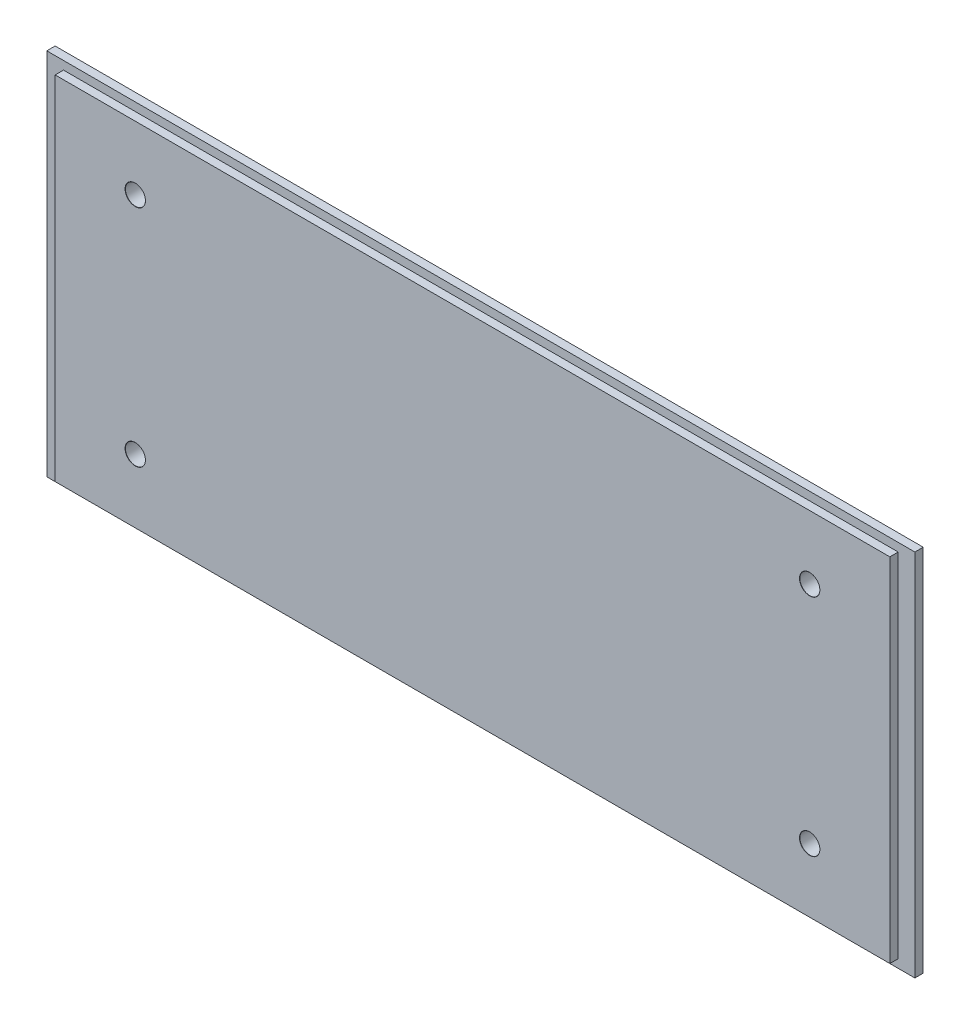
ISO-10303-21;
HEADER;
FILE_DESCRIPTION(('STEP AP214'),'2;1');
FILE_NAME('part.step','',(''),(''),'','','');
FILE_SCHEMA(('AUTOMOTIVE_DESIGN { 1 0 10303 214 1 1 1 1 }'));
ENDSEC;
DATA;
#1=APPLICATION_CONTEXT('core data for automotive mechanical design processes');
#2=APPLICATION_PROTOCOL_DEFINITION('international standard','automotive_design',2000,#1);
#3=PRODUCT_CONTEXT('',#1,'mechanical');
#4=PRODUCT('Part','Part','',(#3));
#5=PRODUCT_RELATED_PRODUCT_CATEGORY('part','',(#4));
#6=PRODUCT_DEFINITION_FORMATION('','',#4);
#7=PRODUCT_DEFINITION_CONTEXT('part definition',#1,'design');
#8=PRODUCT_DEFINITION('design','',#6,#7);
#9=PRODUCT_DEFINITION_SHAPE('','',#8);
#10=(LENGTH_UNIT() NAMED_UNIT(*) SI_UNIT(.MILLI.,.METRE.));
#11=(NAMED_UNIT(*) PLANE_ANGLE_UNIT() SI_UNIT($,.RADIAN.));
#12=(NAMED_UNIT(*) SI_UNIT($,.STERADIAN.) SOLID_ANGLE_UNIT());
#13=UNCERTAINTY_MEASURE_WITH_UNIT(LENGTH_MEASURE(1.E-05),#10,'distance_accuracy_value','');
#14=(GEOMETRIC_REPRESENTATION_CONTEXT(3) GLOBAL_UNCERTAINTY_ASSIGNED_CONTEXT((#13)) GLOBAL_UNIT_ASSIGNED_CONTEXT((#10,
#11,#12)) REPRESENTATION_CONTEXT('',''));
#15=CARTESIAN_POINT('',(0.,0.,0.));
#16=DIRECTION('',(0.,0.,1.));
#17=DIRECTION('',(1.,0.,0.));
#18=AXIS2_PLACEMENT_3D('',#15,#16,#17);
#19=CARTESIAN_POINT('',(-63.2916024653313,33.3513097072419,2.5));
#20=DIRECTION('',(1.,0.,0.));
#21=DIRECTION('',(0.,0.,-1.));
#22=AXIS2_PLACEMENT_3D('',#19,#20,#21);
#23=PLANE('',#22);
#24=DIRECTION('',(0.,-1.,0.));
#25=VECTOR('',#24,1.);
#26=CARTESIAN_POINT('',(-63.2916024653313,33.3513097072419,1.25));
#27=LINE('',#26,#25);
#28=CARTESIAN_POINT('',(-63.2916024653313,33.3513097072419,1.25));
#29=VERTEX_POINT('',#28);
#30=CARTESIAN_POINT('',(-63.2916024653313,-21.8986902927581,1.25));
#31=VERTEX_POINT('',#30);
#32=EDGE_CURVE('E136',#29,#31,#27,.T.);
#33=ORIENTED_EDGE('',*,*,#32,.F.);
#34=DIRECTION('',(0.,0.,-1.));
#35=VECTOR('',#34,1.);
#36=CARTESIAN_POINT('',(-63.2916024653313,33.3513097072419,2.5));
#37=LINE('',#36,#35);
#38=CARTESIAN_POINT('',(-63.2916024653313,33.3513097072419,0.));
#39=VERTEX_POINT('',#38);
#40=EDGE_CURVE('E158',#29,#39,#37,.T.);
#41=ORIENTED_EDGE('',*,*,#40,.T.);
#42=DIRECTION('',(0.,-1.,0.));
#43=VECTOR('',#42,1.);
#44=CARTESIAN_POINT('',(-63.2916024653313,33.3513097072419,0.));
#45=LINE('',#44,#43);
#46=CARTESIAN_POINT('',(-63.2916024653313,-21.8986902927581,0.));
#47=VERTEX_POINT('',#46);
#48=EDGE_CURVE('E146',#39,#47,#45,.T.);
#49=ORIENTED_EDGE('',*,*,#48,.T.);
#50=DIRECTION('',(0.,0.,-1.));
#51=VECTOR('',#50,1.);
#52=CARTESIAN_POINT('',(-63.2916024653313,-21.8986902927581,2.5));
#53=LINE('',#52,#51);
#54=EDGE_CURVE('E11',#31,#47,#53,.T.);
#55=ORIENTED_EDGE('',*,*,#54,.F.);
#56=EDGE_LOOP('',(#33,#41,#49,#55));
#57=FACE_BOUND('',#56,.T.);
#58=ADVANCED_FACE('F33',(#57),#23,.F.);
#59=CARTESIAN_POINT('',(-63.2916024653313,-21.8986902927581,2.5));
#60=DIRECTION('',(0.,1.,0.));
#61=DIRECTION('',(0.,0.,1.));
#62=AXIS2_PLACEMENT_3D('',#59,#60,#61);
#63=PLANE('',#62);
#64=DIRECTION('',(1.,0.,0.));
#65=VECTOR('',#64,1.);
#66=CARTESIAN_POINT('',(-63.2916024653313,-21.8986902927581,1.25));
#67=LINE('',#66,#65);
#68=CARTESIAN_POINT('',(66.7083975346687,-21.8986902927581,1.25));
#69=VERTEX_POINT('',#68);
#70=EDGE_CURVE('E141',#31,#69,#67,.T.);
#71=ORIENTED_EDGE('',*,*,#70,.F.);
#72=ORIENTED_EDGE('',*,*,#54,.T.);
#73=DIRECTION('',(1.,0.,0.));
#74=VECTOR('',#73,1.);
#75=CARTESIAN_POINT('',(-63.2916024653313,-21.8986902927581,0.));
#76=LINE('',#75,#74);
#77=CARTESIAN_POINT('',(66.7083975346687,-21.8986902927581,0.));
#78=VERTEX_POINT('',#77);
#79=EDGE_CURVE('E149',#47,#78,#76,.T.);
#80=ORIENTED_EDGE('',*,*,#79,.T.);
#81=DIRECTION('',(0.,0.,-1.));
#82=VECTOR('',#81,1.);
#83=CARTESIAN_POINT('',(66.7083975346687,-21.8986902927581,2.5));
#84=LINE('',#83,#82);
#85=EDGE_CURVE('E40',#69,#78,#84,.T.);
#86=ORIENTED_EDGE('',*,*,#85,.F.);
#87=EDGE_LOOP('',(#71,#72,#80,#86));
#88=FACE_BOUND('',#87,.T.);
#89=ADVANCED_FACE('F170',(#88),#63,.F.);
#90=CARTESIAN_POINT('',(66.7083975346687,33.3513097072419,2.5));
#91=DIRECTION('',(-1.,0.,0.));
#92=DIRECTION('',(0.,-1.,0.));
#93=AXIS2_PLACEMENT_3D('',#90,#91,#92);
#94=PLANE('',#93);
#95=DIRECTION('',(0.,1.,0.));
#96=VECTOR('',#95,1.);
#97=CARTESIAN_POINT('',(66.7083975346687,33.3513097072419,1.25));
#98=LINE('',#97,#96);
#99=CARTESIAN_POINT('',(66.7083975346687,33.3513097072419,1.25));
#100=VERTEX_POINT('',#99);
#101=EDGE_CURVE('E47',#69,#100,#98,.T.);
#102=ORIENTED_EDGE('',*,*,#101,.F.);
#103=ORIENTED_EDGE('',*,*,#85,.T.);
#104=DIRECTION('',(0.,1.,0.));
#105=VECTOR('',#104,1.);
#106=CARTESIAN_POINT('',(66.7083975346687,33.3513097072419,0.));
#107=LINE('',#106,#105);
#108=CARTESIAN_POINT('',(66.7083975346687,33.3513097072419,0.));
#109=VERTEX_POINT('',#108);
#110=EDGE_CURVE('E152',#78,#109,#107,.T.);
#111=ORIENTED_EDGE('',*,*,#110,.T.);
#112=DIRECTION('',(0.,0.,-1.));
#113=VECTOR('',#112,1.);
#114=CARTESIAN_POINT('',(66.7083975346687,33.3513097072419,2.5));
#115=LINE('',#114,#113);
#116=EDGE_CURVE('E160',#100,#109,#115,.T.);
#117=ORIENTED_EDGE('',*,*,#116,.F.);
#118=EDGE_LOOP('',(#102,#103,#111,#117));
#119=FACE_BOUND('',#118,.T.);
#120=ADVANCED_FACE('F163',(#119),#94,.F.);
#121=CARTESIAN_POINT('',(-63.2916024653313,33.3513097072419,2.5));
#122=DIRECTION('',(0.,-1.,0.));
#123=DIRECTION('',(0.,0.,-1.));
#124=AXIS2_PLACEMENT_3D('',#121,#122,#123);
#125=PLANE('',#124);
#126=DIRECTION('',(-1.,0.,0.));
#127=VECTOR('',#126,1.);
#128=CARTESIAN_POINT('',(-63.2916024653313,33.3513097072419,1.25));
#129=LINE('',#128,#127);
#130=EDGE_CURVE('E144',#100,#29,#129,.T.);
#131=ORIENTED_EDGE('',*,*,#130,.F.);
#132=ORIENTED_EDGE('',*,*,#116,.T.);
#133=DIRECTION('',(-1.,0.,0.));
#134=VECTOR('',#133,1.);
#135=CARTESIAN_POINT('',(-63.2916024653313,33.3513097072419,0.));
#136=LINE('',#135,#134);
#137=EDGE_CURVE('E155',#109,#39,#136,.T.);
#138=ORIENTED_EDGE('',*,*,#137,.T.);
#139=ORIENTED_EDGE('',*,*,#40,.F.);
#140=EDGE_LOOP('',(#131,#132,#138,#139));
#141=FACE_BOUND('',#140,.T.);
#142=ADVANCED_FACE('F177',(#141),#125,.F.);
#143=CARTESIAN_POINT('',(0.,0.,0.));
#144=DIRECTION('',(0.,0.,1.));
#145=DIRECTION('',(1.,0.,0.));
#146=AXIS2_PLACEMENT_3D('',#143,#144,#145);
#147=PLANE('',#146);
#148=CARTESIAN_POINT('',(-48.7916024653313,22.5513097072419,0.));
#149=DIRECTION('',(0.,0.,1.));
#150=DIRECTION('',(1.,0.,0.));
#151=AXIS2_PLACEMENT_3D('',#148,#149,#150);
#152=CIRCLE('',#151,1.5);
#153=CARTESIAN_POINT('',(-47.2916024653313,22.5513097072419,0.));
#154=VERTEX_POINT('',#153);
#155=EDGE_CURVE('E252',#154,#154,#152,.T.);
#156=ORIENTED_EDGE('',*,*,#155,.T.);
#157=EDGE_LOOP('',(#156));
#158=FACE_BOUND('',#157,.T.);
#159=CARTESIAN_POINT('',(-48.7916024653313,-11.098690292758,0.));
#160=DIRECTION('',(0.,0.,1.));
#161=DIRECTION('',(1.,0.,0.));
#162=AXIS2_PLACEMENT_3D('',#159,#160,#161);
#163=CIRCLE('',#162,1.5);
#164=CARTESIAN_POINT('',(-47.2916024653313,-11.098690292758,0.));
#165=VERTEX_POINT('',#164);
#166=EDGE_CURVE('E263',#165,#165,#163,.T.);
#167=ORIENTED_EDGE('',*,*,#166,.T.);
#168=EDGE_LOOP('',(#167));
#169=FACE_BOUND('',#168,.T.);
#170=CARTESIAN_POINT('',(52.2083975346687,-11.098690292758,0.));
#171=DIRECTION('',(0.,0.,1.));
#172=DIRECTION('',(1.,0.,0.));
#173=AXIS2_PLACEMENT_3D('',#170,#171,#172);
#174=CIRCLE('',#173,1.5);
#175=CARTESIAN_POINT('',(53.7083975346687,-11.098690292758,0.));
#176=VERTEX_POINT('',#175);
#177=EDGE_CURVE('E272',#176,#176,#174,.T.);
#178=ORIENTED_EDGE('',*,*,#177,.T.);
#179=EDGE_LOOP('',(#178));
#180=FACE_BOUND('',#179,.T.);
#181=CARTESIAN_POINT('',(52.2083975346687,22.5513097072419,0.));
#182=DIRECTION('',(0.,0.,1.));
#183=DIRECTION('',(1.,0.,0.));
#184=AXIS2_PLACEMENT_3D('',#181,#182,#183);
#185=CIRCLE('',#184,1.5);
#186=CARTESIAN_POINT('',(53.7083975346687,22.5513097072419,0.));
#187=VERTEX_POINT('',#186);
#188=EDGE_CURVE('E126',#187,#187,#185,.T.);
#189=ORIENTED_EDGE('',*,*,#188,.T.);
#190=EDGE_LOOP('',(#189));
#191=FACE_BOUND('',#190,.T.);
#192=ORIENTED_EDGE('',*,*,#48,.F.);
#193=ORIENTED_EDGE('',*,*,#137,.F.);
#194=ORIENTED_EDGE('',*,*,#110,.F.);
#195=ORIENTED_EDGE('',*,*,#79,.F.);
#196=EDGE_LOOP('',(#192,#193,#194,#195));
#197=FACE_BOUND('',#196,.T.);
#198=ADVANCED_FACE('F174',(#158,#169,#180,#191,#197),#147,.F.);
#199=CARTESIAN_POINT('',(0.,0.,1.25));
#200=DIRECTION('',(0.,0.,1.));
#201=DIRECTION('',(1.,0.,0.));
#202=AXIS2_PLACEMENT_3D('',#199,#200,#201);
#203=PLANE('',#202);
#204=DIRECTION('',(-1.,0.,0.));
#205=VECTOR('',#204,1.);
#206=CARTESIAN_POINT('',(-60.7916024653313,32.1013097072419,1.25));
#207=LINE('',#206,#205);
#208=CARTESIAN_POINT('',(64.2083975346687,32.1013097072419,1.25));
#209=VERTEX_POINT('',#208);
#210=CARTESIAN_POINT('',(-60.7916024653313,32.1013097072419,1.25));
#211=VERTEX_POINT('',#210);
#212=EDGE_CURVE('E108',#209,#211,#207,.T.);
#213=ORIENTED_EDGE('',*,*,#212,.F.);
#214=DIRECTION('',(0.,1.,0.));
#215=VECTOR('',#214,1.);
#216=CARTESIAN_POINT('',(64.2083975346687,32.1013097072419,1.25));
#217=LINE('',#216,#215);
#218=CARTESIAN_POINT('',(64.2083975346687,-20.6486902927581,1.25));
#219=VERTEX_POINT('',#218);
#220=EDGE_CURVE('E117',#219,#209,#217,.T.);
#221=ORIENTED_EDGE('',*,*,#220,.F.);
#222=DIRECTION('',(1.,0.,0.));
#223=VECTOR('',#222,1.);
#224=CARTESIAN_POINT('',(-60.7916024653313,-20.6486902927581,1.25));
#225=LINE('',#224,#223);
#226=CARTESIAN_POINT('',(-60.7916024653313,-20.6486902927581,1.25));
#227=VERTEX_POINT('',#226);
#228=EDGE_CURVE('E100',#227,#219,#225,.T.);
#229=ORIENTED_EDGE('',*,*,#228,.F.);
#230=DIRECTION('',(0.,-1.,0.));
#231=VECTOR('',#230,1.);
#232=CARTESIAN_POINT('',(-60.7916024653313,32.1013097072419,1.25));
#233=LINE('',#232,#231);
#234=EDGE_CURVE('E114',#211,#227,#233,.T.);
#235=ORIENTED_EDGE('',*,*,#234,.F.);
#236=EDGE_LOOP('',(#213,#221,#229,#235));
#237=FACE_BOUND('',#236,.T.);
#238=ORIENTED_EDGE('',*,*,#32,.T.);
#239=ORIENTED_EDGE('',*,*,#70,.T.);
#240=ORIENTED_EDGE('',*,*,#101,.T.);
#241=ORIENTED_EDGE('',*,*,#130,.T.);
#242=EDGE_LOOP('',(#238,#239,#240,#241));
#243=FACE_BOUND('',#242,.T.);
#244=ADVANCED_FACE('F113',(#237,#243),#203,.T.);
#245=CARTESIAN_POINT('',(-60.7916024653313,32.1013097072419,1.25));
#246=DIRECTION('',(-1.,0.,0.));
#247=DIRECTION('',(0.,-1.,0.));
#248=AXIS2_PLACEMENT_3D('',#245,#246,#247);
#249=PLANE('',#248);
#250=DIRECTION('',(0.,-1.,0.));
#251=VECTOR('',#250,1.);
#252=CARTESIAN_POINT('',(-60.7916024653313,32.1013097072419,2.5));
#253=LINE('',#252,#251);
#254=CARTESIAN_POINT('',(-60.7916024653313,32.1013097072419,2.5));
#255=VERTEX_POINT('',#254);
#256=CARTESIAN_POINT('',(-60.7916024653313,-20.6486902927581,2.5));
#257=VERTEX_POINT('',#256);
#258=EDGE_CURVE('E131',#255,#257,#253,.T.);
#259=ORIENTED_EDGE('',*,*,#258,.F.);
#260=DIRECTION('',(0.,0.,1.));
#261=VECTOR('',#260,1.);
#262=CARTESIAN_POINT('',(-60.7916024653313,32.1013097072419,1.25));
#263=LINE('',#262,#261);
#264=EDGE_CURVE('E120',#211,#255,#263,.T.);
#265=ORIENTED_EDGE('',*,*,#264,.F.);
#266=ORIENTED_EDGE('',*,*,#234,.T.);
#267=DIRECTION('',(0.,0.,1.));
#268=VECTOR('',#267,1.);
#269=CARTESIAN_POINT('',(-60.7916024653313,-20.6486902927581,1.25));
#270=LINE('',#269,#268);
#271=EDGE_CURVE('E97',#227,#257,#270,.T.);
#272=ORIENTED_EDGE('',*,*,#271,.T.);
#273=EDGE_LOOP('',(#259,#265,#266,#272));
#274=FACE_BOUND('',#273,.T.);
#275=ADVANCED_FACE('F119',(#274),#249,.T.);
#276=CARTESIAN_POINT('',(-60.7916024653313,32.1013097072419,1.25));
#277=DIRECTION('',(0.,1.,0.));
#278=DIRECTION('',(0.,0.,1.));
#279=AXIS2_PLACEMENT_3D('',#276,#277,#278);
#280=PLANE('',#279);
#281=DIRECTION('',(-1.,0.,0.));
#282=VECTOR('',#281,1.);
#283=CARTESIAN_POINT('',(-60.7916024653313,32.1013097072419,2.5));
#284=LINE('',#283,#282);
#285=CARTESIAN_POINT('',(64.2083975346687,32.1013097072419,2.5));
#286=VERTEX_POINT('',#285);
#287=EDGE_CURVE('E121',#286,#255,#284,.T.);
#288=ORIENTED_EDGE('',*,*,#287,.F.);
#289=DIRECTION('',(0.,0.,1.));
#290=VECTOR('',#289,1.);
#291=CARTESIAN_POINT('',(64.2083975346687,32.1013097072419,1.25));
#292=LINE('',#291,#290);
#293=EDGE_CURVE('E137',#209,#286,#292,.T.);
#294=ORIENTED_EDGE('',*,*,#293,.F.);
#295=ORIENTED_EDGE('',*,*,#212,.T.);
#296=ORIENTED_EDGE('',*,*,#264,.T.);
#297=EDGE_LOOP('',(#288,#294,#295,#296));
#298=FACE_BOUND('',#297,.T.);
#299=ADVANCED_FACE('F203',(#298),#280,.T.);
#300=CARTESIAN_POINT('',(64.2083975346687,32.1013097072419,1.25));
#301=DIRECTION('',(1.,0.,0.));
#302=DIRECTION('',(0.,0.,-1.));
#303=AXIS2_PLACEMENT_3D('',#300,#301,#302);
#304=PLANE('',#303);
#305=DIRECTION('',(0.,1.,0.));
#306=VECTOR('',#305,1.);
#307=CARTESIAN_POINT('',(64.2083975346687,32.1013097072419,2.5));
#308=LINE('',#307,#306);
#309=CARTESIAN_POINT('',(64.2083975346687,-20.6486902927581,2.5));
#310=VERTEX_POINT('',#309);
#311=EDGE_CURVE('E55',#310,#286,#308,.T.);
#312=ORIENTED_EDGE('',*,*,#311,.F.);
#313=DIRECTION('',(0.,0.,1.));
#314=VECTOR('',#313,1.);
#315=CARTESIAN_POINT('',(64.2083975346687,-20.6486902927581,1.25));
#316=LINE('',#315,#314);
#317=EDGE_CURVE('E107',#219,#310,#316,.T.);
#318=ORIENTED_EDGE('',*,*,#317,.F.);
#319=ORIENTED_EDGE('',*,*,#220,.T.);
#320=ORIENTED_EDGE('',*,*,#293,.T.);
#321=EDGE_LOOP('',(#312,#318,#319,#320));
#322=FACE_BOUND('',#321,.T.);
#323=ADVANCED_FACE('F206',(#322),#304,.T.);
#324=CARTESIAN_POINT('',(-60.7916024653313,-20.6486902927581,1.25));
#325=DIRECTION('',(0.,-1.,0.));
#326=DIRECTION('',(0.,0.,-1.));
#327=AXIS2_PLACEMENT_3D('',#324,#325,#326);
#328=PLANE('',#327);
#329=DIRECTION('',(1.,0.,0.));
#330=VECTOR('',#329,1.);
#331=CARTESIAN_POINT('',(-60.7916024653313,-20.6486902927581,2.5));
#332=LINE('',#331,#330);
#333=EDGE_CURVE('E102',#257,#310,#332,.T.);
#334=ORIENTED_EDGE('',*,*,#333,.F.);
#335=ORIENTED_EDGE('',*,*,#271,.F.);
#336=ORIENTED_EDGE('',*,*,#228,.T.);
#337=ORIENTED_EDGE('',*,*,#317,.T.);
#338=EDGE_LOOP('',(#334,#335,#336,#337));
#339=FACE_BOUND('',#338,.T.);
#340=ADVANCED_FACE('F99',(#339),#328,.T.);
#341=CARTESIAN_POINT('',(0.,0.,2.5));
#342=DIRECTION('',(0.,0.,1.));
#343=DIRECTION('',(1.,0.,0.));
#344=AXIS2_PLACEMENT_3D('',#341,#342,#343);
#345=PLANE('',#344);
#346=CARTESIAN_POINT('',(-48.7916024653313,22.5513097072419,2.5));
#347=DIRECTION('',(0.,0.,1.));
#348=DIRECTION('',(1.,0.,0.));
#349=AXIS2_PLACEMENT_3D('',#346,#347,#348);
#350=CIRCLE('',#349,1.525);
#351=CARTESIAN_POINT('',(-47.2666024653313,22.5513097072419,2.5));
#352=VERTEX_POINT('',#351);
#353=EDGE_CURVE('E250',#352,#352,#350,.T.);
#354=ORIENTED_EDGE('',*,*,#353,.F.);
#355=EDGE_LOOP('',(#354));
#356=FACE_BOUND('',#355,.T.);
#357=CARTESIAN_POINT('',(-48.7916024653313,-11.098690292758,2.5));
#358=DIRECTION('',(0.,0.,1.));
#359=DIRECTION('',(1.,0.,0.));
#360=AXIS2_PLACEMENT_3D('',#357,#358,#359);
#361=CIRCLE('',#360,1.525);
#362=CARTESIAN_POINT('',(-47.2666024653313,-11.098690292758,2.5));
#363=VERTEX_POINT('',#362);
#364=EDGE_CURVE('E257',#363,#363,#361,.T.);
#365=ORIENTED_EDGE('',*,*,#364,.F.);
#366=EDGE_LOOP('',(#365));
#367=FACE_BOUND('',#366,.T.);
#368=CARTESIAN_POINT('',(52.2083975346687,-11.098690292758,2.5));
#369=DIRECTION('',(0.,0.,1.));
#370=DIRECTION('',(1.,0.,0.));
#371=AXIS2_PLACEMENT_3D('',#368,#369,#370);
#372=CIRCLE('',#371,1.525);
#373=CARTESIAN_POINT('',(53.7333975346687,-11.098690292758,2.5));
#374=VERTEX_POINT('',#373);
#375=EDGE_CURVE('E266',#374,#374,#372,.T.);
#376=ORIENTED_EDGE('',*,*,#375,.F.);
#377=EDGE_LOOP('',(#376));
#378=FACE_BOUND('',#377,.T.);
#379=CARTESIAN_POINT('',(52.2083975346687,22.5513097072419,2.5));
#380=DIRECTION('',(0.,0.,1.));
#381=DIRECTION('',(1.,0.,0.));
#382=AXIS2_PLACEMENT_3D('',#379,#380,#381);
#383=CIRCLE('',#382,1.525);
#384=CARTESIAN_POINT('',(53.7333975346687,22.5513097072419,2.5));
#385=VERTEX_POINT('',#384);
#386=EDGE_CURVE('E275',#385,#385,#383,.T.);
#387=ORIENTED_EDGE('',*,*,#386,.F.);
#388=EDGE_LOOP('',(#387));
#389=FACE_BOUND('',#388,.T.);
#390=ORIENTED_EDGE('',*,*,#287,.T.);
#391=ORIENTED_EDGE('',*,*,#258,.T.);
#392=ORIENTED_EDGE('',*,*,#333,.T.);
#393=ORIENTED_EDGE('',*,*,#311,.T.);
#394=EDGE_LOOP('',(#390,#391,#392,#393));
#395=FACE_BOUND('',#394,.T.);
#396=ADVANCED_FACE('F194',(#356,#367,#378,#389,#395),#345,.T.);
#397=CARTESIAN_POINT('',(52.2083975346687,22.5513097072419,2.5));
#398=DIRECTION('',(0.,0.,1.));
#399=DIRECTION('',(1.,0.,0.));
#400=AXIS2_PLACEMENT_3D('',#397,#398,#399);
#401=CYLINDRICAL_SURFACE('',#400,1.5);
#402=ORIENTED_EDGE('',*,*,#188,.F.);
#403=EDGE_LOOP('',(#402));
#404=FACE_BOUND('',#403,.T.);
#405=CARTESIAN_POINT('',(52.2083975346687,22.5513097072419,2.475));
#406=DIRECTION('',(0.,0.,1.));
#407=DIRECTION('',(1.,0.,0.));
#408=AXIS2_PLACEMENT_3D('',#405,#406,#407);
#409=CIRCLE('',#408,1.5);
#410=CARTESIAN_POINT('',(53.7083975346687,22.5513097072419,2.475));
#411=VERTEX_POINT('',#410);
#412=EDGE_CURVE('E277',#411,#411,#409,.T.);
#413=ORIENTED_EDGE('',*,*,#412,.T.);
#414=EDGE_LOOP('',(#413));
#415=FACE_BOUND('',#414,.T.);
#416=ADVANCED_FACE('F197',(#404,#415),#401,.F.);
#417=CARTESIAN_POINT('',(52.2083975346687,22.5513097072419,2.5));
#418=DIRECTION('',(0.,0.,1.));
#419=DIRECTION('',(1.,0.,0.));
#420=AXIS2_PLACEMENT_3D('',#417,#418,#419);
#421=CONICAL_SURFACE('',#420,1.525,0.785398163397379);
#422=ORIENTED_EDGE('',*,*,#412,.F.);
#423=EDGE_LOOP('',(#422));
#424=FACE_BOUND('',#423,.T.);
#425=ORIENTED_EDGE('',*,*,#386,.T.);
#426=EDGE_LOOP('',(#425));
#427=FACE_BOUND('',#426,.T.);
#428=ADVANCED_FACE('F214',(#424,#427),#421,.F.);
#429=CARTESIAN_POINT('',(52.2083975346687,-11.098690292758,2.5));
#430=DIRECTION('',(0.,0.,1.));
#431=DIRECTION('',(1.,0.,0.));
#432=AXIS2_PLACEMENT_3D('',#429,#430,#431);
#433=CYLINDRICAL_SURFACE('',#432,1.5);
#434=ORIENTED_EDGE('',*,*,#177,.F.);
#435=EDGE_LOOP('',(#434));
#436=FACE_BOUND('',#435,.T.);
#437=CARTESIAN_POINT('',(52.2083975346687,-11.098690292758,2.475));
#438=DIRECTION('',(0.,0.,1.));
#439=DIRECTION('',(1.,0.,0.));
#440=AXIS2_PLACEMENT_3D('',#437,#438,#439);
#441=CIRCLE('',#440,1.5);
#442=CARTESIAN_POINT('',(53.7083975346687,-11.098690292758,2.475));
#443=VERTEX_POINT('',#442);
#444=EDGE_CURVE('E269',#443,#443,#441,.T.);
#445=ORIENTED_EDGE('',*,*,#444,.T.);
#446=EDGE_LOOP('',(#445));
#447=FACE_BOUND('',#446,.T.);
#448=ADVANCED_FACE('F218',(#436,#447),#433,.F.);
#449=CARTESIAN_POINT('',(52.2083975346687,-11.098690292758,2.5));
#450=DIRECTION('',(0.,0.,1.));
#451=DIRECTION('',(1.,0.,0.));
#452=AXIS2_PLACEMENT_3D('',#449,#450,#451);
#453=CONICAL_SURFACE('',#452,1.525,0.785398163397379);
#454=ORIENTED_EDGE('',*,*,#444,.F.);
#455=EDGE_LOOP('',(#454));
#456=FACE_BOUND('',#455,.T.);
#457=ORIENTED_EDGE('',*,*,#375,.T.);
#458=EDGE_LOOP('',(#457));
#459=FACE_BOUND('',#458,.T.);
#460=ADVANCED_FACE('F222',(#456,#459),#453,.F.);
#461=CARTESIAN_POINT('',(-48.7916024653313,-11.098690292758,2.5));
#462=DIRECTION('',(0.,0.,1.));
#463=DIRECTION('',(1.,0.,0.));
#464=AXIS2_PLACEMENT_3D('',#461,#462,#463);
#465=CYLINDRICAL_SURFACE('',#464,1.5);
#466=ORIENTED_EDGE('',*,*,#166,.F.);
#467=EDGE_LOOP('',(#466));
#468=FACE_BOUND('',#467,.T.);
#469=CARTESIAN_POINT('',(-48.7916024653313,-11.098690292758,2.475));
#470=DIRECTION('',(0.,0.,1.));
#471=DIRECTION('',(1.,0.,0.));
#472=AXIS2_PLACEMENT_3D('',#469,#470,#471);
#473=CIRCLE('',#472,1.5);
#474=CARTESIAN_POINT('',(-47.2916024653313,-11.098690292758,2.475));
#475=VERTEX_POINT('',#474);
#476=EDGE_CURVE('E260',#475,#475,#473,.T.);
#477=ORIENTED_EDGE('',*,*,#476,.T.);
#478=EDGE_LOOP('',(#477));
#479=FACE_BOUND('',#478,.T.);
#480=ADVANCED_FACE('F226',(#468,#479),#465,.F.);
#481=CARTESIAN_POINT('',(-48.7916024653313,-11.098690292758,2.5));
#482=DIRECTION('',(0.,0.,1.));
#483=DIRECTION('',(1.,0.,0.));
#484=AXIS2_PLACEMENT_3D('',#481,#482,#483);
#485=CONICAL_SURFACE('',#484,1.525,0.785398163397379);
#486=ORIENTED_EDGE('',*,*,#476,.F.);
#487=EDGE_LOOP('',(#486));
#488=FACE_BOUND('',#487,.T.);
#489=ORIENTED_EDGE('',*,*,#364,.T.);
#490=EDGE_LOOP('',(#489));
#491=FACE_BOUND('',#490,.T.);
#492=ADVANCED_FACE('F230',(#488,#491),#485,.F.);
#493=CARTESIAN_POINT('',(-48.7916024653313,22.5513097072419,2.5));
#494=DIRECTION('',(0.,0.,1.));
#495=DIRECTION('',(1.,0.,0.));
#496=AXIS2_PLACEMENT_3D('',#493,#494,#495);
#497=CYLINDRICAL_SURFACE('',#496,1.5);
#498=ORIENTED_EDGE('',*,*,#155,.F.);
#499=EDGE_LOOP('',(#498));
#500=FACE_BOUND('',#499,.T.);
#501=CARTESIAN_POINT('',(-48.7916024653313,22.5513097072419,2.475));
#502=DIRECTION('',(0.,0.,1.));
#503=DIRECTION('',(1.,0.,0.));
#504=AXIS2_PLACEMENT_3D('',#501,#502,#503);
#505=CIRCLE('',#504,1.5);
#506=CARTESIAN_POINT('',(-47.2916024653313,22.5513097072419,2.475));
#507=VERTEX_POINT('',#506);
#508=EDGE_CURVE('E247',#507,#507,#505,.T.);
#509=ORIENTED_EDGE('',*,*,#508,.T.);
#510=EDGE_LOOP('',(#509));
#511=FACE_BOUND('',#510,.T.);
#512=ADVANCED_FACE('F234',(#500,#511),#497,.F.);
#513=CARTESIAN_POINT('',(-48.7916024653313,22.5513097072419,2.5));
#514=DIRECTION('',(0.,0.,1.));
#515=DIRECTION('',(1.,0.,0.));
#516=AXIS2_PLACEMENT_3D('',#513,#514,#515);
#517=CONICAL_SURFACE('',#516,1.525,0.785398163397379);
#518=ORIENTED_EDGE('',*,*,#508,.F.);
#519=EDGE_LOOP('',(#518));
#520=FACE_BOUND('',#519,.T.);
#521=ORIENTED_EDGE('',*,*,#353,.T.);
#522=EDGE_LOOP('',(#521));
#523=FACE_BOUND('',#522,.T.);
#524=ADVANCED_FACE('F238',(#520,#523),#517,.F.);
#525=CLOSED_SHELL('',(#58,#89,#120,#142,#198,#244,#275,#299,#323,#340,#396,#416,#428,#448,#460,
#480,#492,#512,#524));
#526=MANIFOLD_SOLID_BREP('B2',#525);
#527=ADVANCED_BREP_SHAPE_REPRESENTATION('',(#18,#526),#14);
#528=SHAPE_DEFINITION_REPRESENTATION(#9,#527);
ENDSEC;
END-ISO-10303-21;
